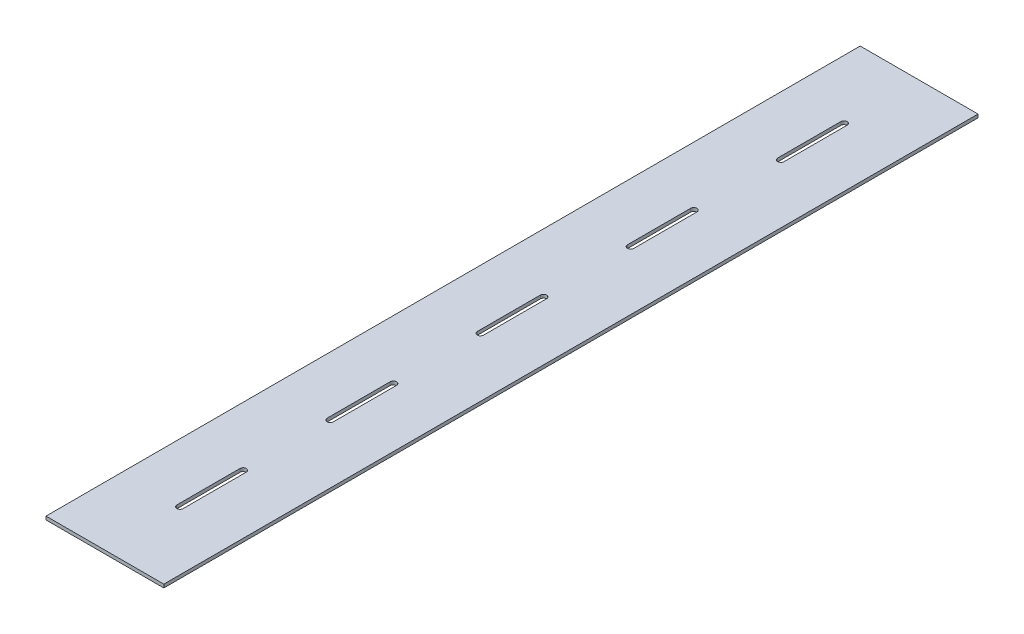
ISO-10303-21;
HEADER;
FILE_DESCRIPTION(('STEP AP214'),'2;1');
FILE_NAME('part.step','',(''),(''),'','','');
FILE_SCHEMA(('AUTOMOTIVE_DESIGN { 1 0 10303 214 1 1 1 1 }'));
ENDSEC;
DATA;
#1=APPLICATION_CONTEXT('core data for automotive mechanical design processes');
#2=APPLICATION_PROTOCOL_DEFINITION('international standard','automotive_design',2000,#1);
#3=PRODUCT_CONTEXT('',#1,'mechanical');
#4=PRODUCT('Part','Part','',(#3));
#5=PRODUCT_RELATED_PRODUCT_CATEGORY('part','',(#4));
#6=PRODUCT_DEFINITION_FORMATION('','',#4);
#7=PRODUCT_DEFINITION_CONTEXT('part definition',#1,'design');
#8=PRODUCT_DEFINITION('design','',#6,#7);
#9=PRODUCT_DEFINITION_SHAPE('','',#8);
#10=(LENGTH_UNIT() NAMED_UNIT(*) SI_UNIT(.MILLI.,.METRE.));
#11=(NAMED_UNIT(*) PLANE_ANGLE_UNIT() SI_UNIT($,.RADIAN.));
#12=(NAMED_UNIT(*) SI_UNIT($,.STERADIAN.) SOLID_ANGLE_UNIT());
#13=UNCERTAINTY_MEASURE_WITH_UNIT(LENGTH_MEASURE(1.E-05),#10,'distance_accuracy_value','');
#14=(GEOMETRIC_REPRESENTATION_CONTEXT(3) GLOBAL_UNCERTAINTY_ASSIGNED_CONTEXT((#13)) GLOBAL_UNIT_ASSIGNED_CONTEXT((#10,
#11,#12)) REPRESENTATION_CONTEXT('',''));
#15=CARTESIAN_POINT('',(0.,0.,0.));
#16=DIRECTION('',(0.,0.,1.));
#17=DIRECTION('',(1.,0.,0.));
#18=AXIS2_PLACEMENT_3D('',#15,#16,#17);
#19=CARTESIAN_POINT('',(7.4999999999999,-1.11022302462516E-13,-639.));
#20=DIRECTION('',(1.,0.,0.));
#21=DIRECTION('',(0.,0.,-1.));
#22=AXIS2_PLACEMENT_3D('',#19,#20,#21);
#23=PLANE('',#22);
#24=DIRECTION('',(0.,0.,-1.));
#25=VECTOR('',#24,1.);
#26=CARTESIAN_POINT('',(7.4999999999999,7.9999999999999,-639.));
#27=LINE('',#26,#25);
#28=CARTESIAN_POINT('',(7.4999999999999,8.00000000000001,-639.));
#29=VERTEX_POINT('',#28);
#30=CARTESIAN_POINT('',(7.4999999999999,7.9999999999999,-789.));
#31=VERTEX_POINT('',#30);
#32=EDGE_CURVE('E371',#29,#31,#27,.T.);
#33=ORIENTED_EDGE('',*,*,#32,.T.);
#34=DIRECTION('',(0.,1.,0.));
#35=VECTOR('',#34,1.);
#36=CARTESIAN_POINT('',(7.4999999999999,-1.11022302462516E-13,-789.));
#37=LINE('',#36,#35);
#38=CARTESIAN_POINT('',(7.4999999999999,0.,-789.));
#39=VERTEX_POINT('',#38);
#40=EDGE_CURVE('E11',#39,#31,#37,.T.);
#41=ORIENTED_EDGE('',*,*,#40,.F.);
#42=DIRECTION('',(0.,0.,-1.));
#43=VECTOR('',#42,1.);
#44=CARTESIAN_POINT('',(7.4999999999999,-1.11022302462516E-13,-639.));
#45=LINE('',#44,#43);
#46=CARTESIAN_POINT('',(7.4999999999999,-1.11022302462516E-13,-639.));
#47=VERTEX_POINT('',#46);
#48=EDGE_CURVE('E375',#47,#39,#45,.T.);
#49=ORIENTED_EDGE('',*,*,#48,.F.);
#50=DIRECTION('',(0.,1.,0.));
#51=VECTOR('',#50,1.);
#52=CARTESIAN_POINT('',(7.4999999999999,-1.11022302462516E-13,-639.));
#53=LINE('',#52,#51);
#54=EDGE_CURVE('E380',#47,#29,#53,.T.);
#55=ORIENTED_EDGE('',*,*,#54,.T.);
#56=EDGE_LOOP('',(#33,#41,#49,#55));
#57=FACE_BOUND('',#56,.T.);
#58=ADVANCED_FACE('F34',(#57),#23,.F.);
#59=CARTESIAN_POINT('',(-1.11022302462516E-13,0.,-789.));
#60=DIRECTION('',(0.,1.,0.));
#61=DIRECTION('',(0.,0.,1.));
#62=AXIS2_PLACEMENT_3D('',#59,#60,#61);
#63=CYLINDRICAL_SURFACE('',#62,7.49999999999999);
#64=CARTESIAN_POINT('',(-1.11022302462516E-13,8.00000000000001,-789.));
#65=DIRECTION('',(0.,1.,0.));
#66=DIRECTION('',(0.,0.,1.));
#67=AXIS2_PLACEMENT_3D('',#64,#65,#66);
#68=CIRCLE('',#67,7.49999999999999);
#69=CARTESIAN_POINT('',(-7.50000000000009,8.00000000000001,-789.));
#70=VERTEX_POINT('',#69);
#71=EDGE_CURVE('E368',#31,#70,#68,.T.);
#72=ORIENTED_EDGE('',*,*,#71,.T.);
#73=DIRECTION('',(0.,1.,0.));
#74=VECTOR('',#73,1.);
#75=CARTESIAN_POINT('',(-7.50000000000009,0.,-789.));
#76=LINE('',#75,#74);
#77=CARTESIAN_POINT('',(-7.50000000000009,0.,-789.));
#78=VERTEX_POINT('',#77);
#79=EDGE_CURVE('E41',#78,#70,#76,.T.);
#80=ORIENTED_EDGE('',*,*,#79,.F.);
#81=CARTESIAN_POINT('',(-1.11022302462516E-13,0.,-789.));
#82=DIRECTION('',(0.,1.,0.));
#83=DIRECTION('',(0.,0.,1.));
#84=AXIS2_PLACEMENT_3D('',#81,#82,#83);
#85=CIRCLE('',#84,7.49999999999999);
#86=EDGE_CURVE('E55',#39,#78,#85,.T.);
#87=ORIENTED_EDGE('',*,*,#86,.F.);
#88=ORIENTED_EDGE('',*,*,#40,.T.);
#89=EDGE_LOOP('',(#72,#80,#87,#88));
#90=FACE_BOUND('',#89,.T.);
#91=ADVANCED_FACE('F390',(#90),#63,.F.);
#92=CARTESIAN_POINT('',(-7.50000000000006,0.,-639.));
#93=DIRECTION('',(-1.,0.,0.));
#94=DIRECTION('',(0.,0.,1.));
#95=AXIS2_PLACEMENT_3D('',#92,#93,#94);
#96=PLANE('',#95);
#97=DIRECTION('',(0.,0.,1.));
#98=VECTOR('',#97,1.);
#99=CARTESIAN_POINT('',(-7.50000000000006,8.00000000000001,-639.));
#100=LINE('',#99,#98);
#101=CARTESIAN_POINT('',(-7.50000000000006,8.00000000000001,-639.));
#102=VERTEX_POINT('',#101);
#103=EDGE_CURVE('E365',#70,#102,#100,.T.);
#104=ORIENTED_EDGE('',*,*,#103,.T.);
#105=DIRECTION('',(0.,1.,0.));
#106=VECTOR('',#105,1.);
#107=CARTESIAN_POINT('',(-7.50000000000006,0.,-639.));
#108=LINE('',#107,#106);
#109=CARTESIAN_POINT('',(-7.50000000000006,0.,-639.));
#110=VERTEX_POINT('',#109);
#111=EDGE_CURVE('E383',#110,#102,#108,.T.);
#112=ORIENTED_EDGE('',*,*,#111,.F.);
#113=DIRECTION('',(0.,0.,1.));
#114=VECTOR('',#113,1.);
#115=CARTESIAN_POINT('',(-7.50000000000006,0.,-639.));
#116=LINE('',#115,#114);
#117=EDGE_CURVE('E378',#78,#110,#116,.T.);
#118=ORIENTED_EDGE('',*,*,#117,.F.);
#119=ORIENTED_EDGE('',*,*,#79,.T.);
#120=EDGE_LOOP('',(#104,#112,#118,#119));
#121=FACE_BOUND('',#120,.T.);
#122=ADVANCED_FACE('F387',(#121),#96,.F.);
#123=CARTESIAN_POINT('',(0.,0.,-639.));
#124=DIRECTION('',(0.,1.,0.));
#125=DIRECTION('',(0.,0.,1.));
#126=AXIS2_PLACEMENT_3D('',#123,#124,#125);
#127=CYLINDRICAL_SURFACE('',#126,7.49999999999998);
#128=CARTESIAN_POINT('',(0.,8.00000000000001,-639.));
#129=DIRECTION('',(0.,1.,0.));
#130=DIRECTION('',(0.,0.,1.));
#131=AXIS2_PLACEMENT_3D('',#128,#129,#130);
#132=CIRCLE('',#131,7.49999999999998);
#133=EDGE_CURVE('E363',#102,#29,#132,.T.);
#134=ORIENTED_EDGE('',*,*,#133,.T.);
#135=ORIENTED_EDGE('',*,*,#54,.F.);
#136=CARTESIAN_POINT('',(0.,0.,-639.));
#137=DIRECTION('',(0.,1.,0.));
#138=DIRECTION('',(0.,0.,1.));
#139=AXIS2_PLACEMENT_3D('',#136,#137,#138);
#140=CIRCLE('',#139,7.49999999999998);
#141=EDGE_CURVE('E48',#110,#47,#140,.T.);
#142=ORIENTED_EDGE('',*,*,#141,.F.);
#143=ORIENTED_EDGE('',*,*,#111,.T.);
#144=EDGE_LOOP('',(#134,#135,#142,#143));
#145=FACE_BOUND('',#144,.T.);
#146=ADVANCED_FACE('F396',(#145),#127,.F.);
#147=CARTESIAN_POINT('',(7.49999999999995,-1.11022302462516E-13,-282.));
#148=DIRECTION('',(1.,0.,0.));
#149=DIRECTION('',(0.,0.,-1.));
#150=AXIS2_PLACEMENT_3D('',#147,#148,#149);
#151=PLANE('',#150);
#152=DIRECTION('',(0.,0.,-1.));
#153=VECTOR('',#152,1.);
#154=CARTESIAN_POINT('',(7.49999999999995,7.9999999999999,-282.));
#155=LINE('',#154,#153);
#156=CARTESIAN_POINT('',(7.49999999999995,8.00000000000001,-282.));
#157=VERTEX_POINT('',#156);
#158=CARTESIAN_POINT('',(7.49999999999995,7.9999999999999,-432.));
#159=VERTEX_POINT('',#158);
#160=EDGE_CURVE('E339',#157,#159,#155,.T.);
#161=ORIENTED_EDGE('',*,*,#160,.T.);
#162=DIRECTION('',(0.,1.,0.));
#163=VECTOR('',#162,1.);
#164=CARTESIAN_POINT('',(7.49999999999995,-1.11022302462516E-13,-432.));
#165=LINE('',#164,#163);
#166=CARTESIAN_POINT('',(7.49999999999995,0.,-432.));
#167=VERTEX_POINT('',#166);
#168=EDGE_CURVE('E360',#167,#159,#165,.T.);
#169=ORIENTED_EDGE('',*,*,#168,.F.);
#170=DIRECTION('',(0.,0.,-1.));
#171=VECTOR('',#170,1.);
#172=CARTESIAN_POINT('',(7.49999999999995,-1.11022302462516E-13,-282.));
#173=LINE('',#172,#171);
#174=CARTESIAN_POINT('',(7.49999999999995,-1.11022302462516E-13,-282.));
#175=VERTEX_POINT('',#174);
#176=EDGE_CURVE('E344',#175,#167,#173,.T.);
#177=ORIENTED_EDGE('',*,*,#176,.F.);
#178=DIRECTION('',(0.,1.,0.));
#179=VECTOR('',#178,1.);
#180=CARTESIAN_POINT('',(7.49999999999995,-1.11022302462516E-13,-282.));
#181=LINE('',#180,#179);
#182=EDGE_CURVE('E351',#175,#157,#181,.T.);
#183=ORIENTED_EDGE('',*,*,#182,.T.);
#184=EDGE_LOOP('',(#161,#169,#177,#183));
#185=FACE_BOUND('',#184,.T.);
#186=ADVANCED_FACE('F398',(#185),#151,.F.);
#187=CARTESIAN_POINT('',(0.,0.,-432.));
#188=DIRECTION('',(0.,1.,0.));
#189=DIRECTION('',(0.,0.,1.));
#190=AXIS2_PLACEMENT_3D('',#187,#188,#189);
#191=CYLINDRICAL_SURFACE('',#190,7.49999999999999);
#192=CARTESIAN_POINT('',(0.,8.00000000000001,-432.));
#193=DIRECTION('',(0.,1.,0.));
#194=DIRECTION('',(0.,0.,1.));
#195=AXIS2_PLACEMENT_3D('',#192,#193,#194);
#196=CIRCLE('',#195,7.49999999999999);
#197=CARTESIAN_POINT('',(-7.50000000000003,8.00000000000001,-432.));
#198=VERTEX_POINT('',#197);
#199=EDGE_CURVE('E336',#159,#198,#196,.T.);
#200=ORIENTED_EDGE('',*,*,#199,.T.);
#201=DIRECTION('',(0.,1.,0.));
#202=VECTOR('',#201,1.);
#203=CARTESIAN_POINT('',(-7.50000000000003,0.,-432.));
#204=LINE('',#203,#202);
#205=CARTESIAN_POINT('',(-7.50000000000003,0.,-432.));
#206=VERTEX_POINT('',#205);
#207=EDGE_CURVE('E357',#206,#198,#204,.T.);
#208=ORIENTED_EDGE('',*,*,#207,.F.);
#209=CARTESIAN_POINT('',(0.,0.,-432.));
#210=DIRECTION('',(0.,1.,0.));
#211=DIRECTION('',(0.,0.,1.));
#212=AXIS2_PLACEMENT_3D('',#209,#210,#211);
#213=CIRCLE('',#212,7.49999999999999);
#214=EDGE_CURVE('E346',#167,#206,#213,.T.);
#215=ORIENTED_EDGE('',*,*,#214,.F.);
#216=ORIENTED_EDGE('',*,*,#168,.T.);
#217=EDGE_LOOP('',(#200,#208,#215,#216));
#218=FACE_BOUND('',#217,.T.);
#219=ADVANCED_FACE('F404',(#218),#191,.F.);
#220=CARTESIAN_POINT('',(-7.50000000000001,0.,-282.));
#221=DIRECTION('',(-1.,0.,0.));
#222=DIRECTION('',(0.,0.,1.));
#223=AXIS2_PLACEMENT_3D('',#220,#221,#222);
#224=PLANE('',#223);
#225=DIRECTION('',(0.,0.,1.));
#226=VECTOR('',#225,1.);
#227=CARTESIAN_POINT('',(-7.5,8.00000000000001,-282.));
#228=LINE('',#227,#226);
#229=CARTESIAN_POINT('',(-7.5,8.00000000000001,-282.));
#230=VERTEX_POINT('',#229);
#231=EDGE_CURVE('E333',#198,#230,#228,.T.);
#232=ORIENTED_EDGE('',*,*,#231,.T.);
#233=DIRECTION('',(0.,1.,0.));
#234=VECTOR('',#233,1.);
#235=CARTESIAN_POINT('',(-7.50000000000001,0.,-282.));
#236=LINE('',#235,#234);
#237=CARTESIAN_POINT('',(-7.50000000000001,0.,-282.));
#238=VERTEX_POINT('',#237);
#239=EDGE_CURVE('E354',#238,#230,#236,.T.);
#240=ORIENTED_EDGE('',*,*,#239,.F.);
#241=DIRECTION('',(0.,0.,1.));
#242=VECTOR('',#241,1.);
#243=CARTESIAN_POINT('',(-7.50000000000001,0.,-282.));
#244=LINE('',#243,#242);
#245=EDGE_CURVE('E348',#206,#238,#244,.T.);
#246=ORIENTED_EDGE('',*,*,#245,.F.);
#247=ORIENTED_EDGE('',*,*,#207,.T.);
#248=EDGE_LOOP('',(#232,#240,#246,#247));
#249=FACE_BOUND('',#248,.T.);
#250=ADVANCED_FACE('F437',(#249),#224,.F.);
#251=CARTESIAN_POINT('',(0.,0.,-282.));
#252=DIRECTION('',(0.,1.,0.));
#253=DIRECTION('',(0.,0.,1.));
#254=AXIS2_PLACEMENT_3D('',#251,#252,#253);
#255=CYLINDRICAL_SURFACE('',#254,7.49999999999998);
#256=CARTESIAN_POINT('',(0.,8.00000000000001,-282.));
#257=DIRECTION('',(0.,1.,0.));
#258=DIRECTION('',(0.,0.,1.));
#259=AXIS2_PLACEMENT_3D('',#256,#257,#258);
#260=CIRCLE('',#259,7.49999999999998);
#261=EDGE_CURVE('E331',#230,#157,#260,.T.);
#262=ORIENTED_EDGE('',*,*,#261,.T.);
#263=ORIENTED_EDGE('',*,*,#182,.F.);
#264=CARTESIAN_POINT('',(0.,0.,-282.));
#265=DIRECTION('',(0.,1.,0.));
#266=DIRECTION('',(0.,0.,1.));
#267=AXIS2_PLACEMENT_3D('',#264,#265,#266);
#268=CIRCLE('',#267,7.49999999999998);
#269=EDGE_CURVE('E342',#238,#175,#268,.T.);
#270=ORIENTED_EDGE('',*,*,#269,.F.);
#271=ORIENTED_EDGE('',*,*,#239,.T.);
#272=EDGE_LOOP('',(#262,#263,#270,#271));
#273=FACE_BOUND('',#272,.T.);
#274=ADVANCED_FACE('F447',(#273),#255,.F.);
#275=CARTESIAN_POINT('',(7.50000000000001,-1.11022302462516E-13,75.0000000000002));
#276=DIRECTION('',(1.,0.,0.));
#277=DIRECTION('',(0.,0.,-1.));
#278=AXIS2_PLACEMENT_3D('',#275,#276,#277);
#279=PLANE('',#278);
#280=DIRECTION('',(0.,0.,-1.));
#281=VECTOR('',#280,1.);
#282=CARTESIAN_POINT('',(7.50000000000001,7.9999999999999,75.0000000000002));
#283=LINE('',#282,#281);
#284=CARTESIAN_POINT('',(7.50000000000001,8.00000000000001,75.0000000000002));
#285=VERTEX_POINT('',#284);
#286=CARTESIAN_POINT('',(7.49999999999998,7.9999999999999,-74.9999999999997));
#287=VERTEX_POINT('',#286);
#288=EDGE_CURVE('E307',#285,#287,#283,.T.);
#289=ORIENTED_EDGE('',*,*,#288,.T.);
#290=DIRECTION('',(0.,1.,0.));
#291=VECTOR('',#290,1.);
#292=CARTESIAN_POINT('',(7.49999999999998,-1.11022302462516E-13,-74.9999999999997));
#293=LINE('',#292,#291);
#294=CARTESIAN_POINT('',(7.49999999999998,0.,-74.9999999999997));
#295=VERTEX_POINT('',#294);
#296=EDGE_CURVE('E328',#295,#287,#293,.T.);
#297=ORIENTED_EDGE('',*,*,#296,.F.);
#298=DIRECTION('',(0.,0.,-1.));
#299=VECTOR('',#298,1.);
#300=CARTESIAN_POINT('',(7.50000000000001,-1.11022302462516E-13,75.0000000000002));
#301=LINE('',#300,#299);
#302=CARTESIAN_POINT('',(7.50000000000001,-1.11022302462516E-13,75.0000000000002));
#303=VERTEX_POINT('',#302);
#304=EDGE_CURVE('E312',#303,#295,#301,.T.);
#305=ORIENTED_EDGE('',*,*,#304,.F.);
#306=DIRECTION('',(0.,1.,0.));
#307=VECTOR('',#306,1.);
#308=CARTESIAN_POINT('',(7.50000000000001,-1.11022302462516E-13,75.0000000000002));
#309=LINE('',#308,#307);
#310=EDGE_CURVE('E319',#303,#285,#309,.T.);
#311=ORIENTED_EDGE('',*,*,#310,.T.);
#312=EDGE_LOOP('',(#289,#297,#305,#311));
#313=FACE_BOUND('',#312,.T.);
#314=ADVANCED_FACE('F457',(#313),#279,.F.);
#315=CARTESIAN_POINT('',(0.,0.,-74.9999999999997));
#316=DIRECTION('',(0.,1.,0.));
#317=DIRECTION('',(0.,0.,1.));
#318=AXIS2_PLACEMENT_3D('',#315,#316,#317);
#319=CYLINDRICAL_SURFACE('',#318,7.49999999999999);
#320=CARTESIAN_POINT('',(0.,8.00000000000001,-74.9999999999997));
#321=DIRECTION('',(0.,1.,0.));
#322=DIRECTION('',(0.,0.,1.));
#323=AXIS2_PLACEMENT_3D('',#320,#321,#322);
#324=CIRCLE('',#323,7.49999999999999);
#325=CARTESIAN_POINT('',(-7.49999999999998,8.00000000000001,-74.9999999999997));
#326=VERTEX_POINT('',#325);
#327=EDGE_CURVE('E304',#287,#326,#324,.T.);
#328=ORIENTED_EDGE('',*,*,#327,.T.);
#329=DIRECTION('',(0.,1.,0.));
#330=VECTOR('',#329,1.);
#331=CARTESIAN_POINT('',(-7.49999999999998,0.,-74.9999999999997));
#332=LINE('',#331,#330);
#333=CARTESIAN_POINT('',(-7.49999999999998,0.,-74.9999999999997));
#334=VERTEX_POINT('',#333);
#335=EDGE_CURVE('E325',#334,#326,#332,.T.);
#336=ORIENTED_EDGE('',*,*,#335,.F.);
#337=CARTESIAN_POINT('',(0.,0.,-74.9999999999997));
#338=DIRECTION('',(0.,1.,0.));
#339=DIRECTION('',(0.,0.,1.));
#340=AXIS2_PLACEMENT_3D('',#337,#338,#339);
#341=CIRCLE('',#340,7.49999999999999);
#342=EDGE_CURVE('E314',#295,#334,#341,.T.);
#343=ORIENTED_EDGE('',*,*,#342,.F.);
#344=ORIENTED_EDGE('',*,*,#296,.T.);
#345=EDGE_LOOP('',(#328,#336,#343,#344));
#346=FACE_BOUND('',#345,.T.);
#347=ADVANCED_FACE('F467',(#346),#319,.F.);
#348=CARTESIAN_POINT('',(-7.49999999999995,0.,75.0000000000002));
#349=DIRECTION('',(-1.,0.,0.));
#350=DIRECTION('',(0.,0.,1.));
#351=AXIS2_PLACEMENT_3D('',#348,#349,#350);
#352=PLANE('',#351);
#353=DIRECTION('',(0.,0.,1.));
#354=VECTOR('',#353,1.);
#355=CARTESIAN_POINT('',(-7.49999999999995,8.00000000000001,75.0000000000002));
#356=LINE('',#355,#354);
#357=CARTESIAN_POINT('',(-7.49999999999995,8.00000000000001,75.0000000000002));
#358=VERTEX_POINT('',#357);
#359=EDGE_CURVE('E301',#326,#358,#356,.T.);
#360=ORIENTED_EDGE('',*,*,#359,.T.);
#361=DIRECTION('',(0.,1.,0.));
#362=VECTOR('',#361,1.);
#363=CARTESIAN_POINT('',(-7.49999999999995,0.,75.0000000000002));
#364=LINE('',#363,#362);
#365=CARTESIAN_POINT('',(-7.49999999999995,0.,75.0000000000002));
#366=VERTEX_POINT('',#365);
#367=EDGE_CURVE('E322',#366,#358,#364,.T.);
#368=ORIENTED_EDGE('',*,*,#367,.F.);
#369=DIRECTION('',(0.,0.,1.));
#370=VECTOR('',#369,1.);
#371=CARTESIAN_POINT('',(-7.49999999999995,0.,75.0000000000002));
#372=LINE('',#371,#370);
#373=EDGE_CURVE('E316',#334,#366,#372,.T.);
#374=ORIENTED_EDGE('',*,*,#373,.F.);
#375=ORIENTED_EDGE('',*,*,#335,.T.);
#376=EDGE_LOOP('',(#360,#368,#374,#375));
#377=FACE_BOUND('',#376,.T.);
#378=ADVANCED_FACE('F477',(#377),#352,.F.);
#379=CARTESIAN_POINT('',(0.,-1.11022302462516E-13,75.0000000000002));
#380=DIRECTION('',(0.,1.,0.));
#381=DIRECTION('',(0.,0.,1.));
#382=AXIS2_PLACEMENT_3D('',#379,#380,#381);
#383=CYLINDRICAL_SURFACE('',#382,7.49999999999998);
#384=CARTESIAN_POINT('',(0.,8.00000000000001,75.0000000000002));
#385=DIRECTION('',(0.,1.,0.));
#386=DIRECTION('',(0.,0.,1.));
#387=AXIS2_PLACEMENT_3D('',#384,#385,#386);
#388=CIRCLE('',#387,7.49999999999998);
#389=EDGE_CURVE('E299',#358,#285,#388,.T.);
#390=ORIENTED_EDGE('',*,*,#389,.T.);
#391=ORIENTED_EDGE('',*,*,#310,.F.);
#392=CARTESIAN_POINT('',(0.,-1.11022302462516E-13,75.0000000000002));
#393=DIRECTION('',(0.,1.,0.));
#394=DIRECTION('',(0.,0.,1.));
#395=AXIS2_PLACEMENT_3D('',#392,#393,#394);
#396=CIRCLE('',#395,7.49999999999998);
#397=EDGE_CURVE('E310',#366,#303,#396,.T.);
#398=ORIENTED_EDGE('',*,*,#397,.F.);
#399=ORIENTED_EDGE('',*,*,#367,.T.);
#400=EDGE_LOOP('',(#390,#391,#398,#399));
#401=FACE_BOUND('',#400,.T.);
#402=ADVANCED_FACE('F487',(#401),#383,.F.);
#403=CARTESIAN_POINT('',(140.,8.00000000000001,-967.5));
#404=DIRECTION('',(-1.,0.,0.));
#405=DIRECTION('',(0.,0.,1.));
#406=AXIS2_PLACEMENT_3D('',#403,#404,#405);
#407=PLANE('',#406);
#408=DIRECTION('',(0.,0.,-1.));
#409=VECTOR('',#408,1.);
#410=CARTESIAN_POINT('',(140.,0.,-967.5));
#411=LINE('',#410,#409);
#412=CARTESIAN_POINT('',(140.,0.,967.5));
#413=VERTEX_POINT('',#412);
#414=CARTESIAN_POINT('',(140.,0.,-967.5));
#415=VERTEX_POINT('',#414);
#416=EDGE_CURVE('E263',#413,#415,#411,.T.);
#417=ORIENTED_EDGE('',*,*,#416,.T.);
#418=DIRECTION('',(0.,-1.,0.));
#419=VECTOR('',#418,1.);
#420=CARTESIAN_POINT('',(140.,8.00000000000001,-967.5));
#421=LINE('',#420,#419);
#422=CARTESIAN_POINT('',(140.,8.00000000000001,-967.5));
#423=VERTEX_POINT('',#422);
#424=EDGE_CURVE('E296',#423,#415,#421,.T.);
#425=ORIENTED_EDGE('',*,*,#424,.F.);
#426=DIRECTION('',(0.,0.,-1.));
#427=VECTOR('',#426,1.);
#428=CARTESIAN_POINT('',(140.,8.00000000000001,-967.5));
#429=LINE('',#428,#427);
#430=CARTESIAN_POINT('',(140.,8.00000000000001,967.5));
#431=VERTEX_POINT('',#430);
#432=EDGE_CURVE('E270',#431,#423,#429,.T.);
#433=ORIENTED_EDGE('',*,*,#432,.F.);
#434=DIRECTION('',(0.,-1.,0.));
#435=VECTOR('',#434,1.);
#436=CARTESIAN_POINT('',(140.,8.00000000000001,967.5));
#437=LINE('',#436,#435);
#438=EDGE_CURVE('E280',#431,#413,#437,.T.);
#439=ORIENTED_EDGE('',*,*,#438,.T.);
#440=EDGE_LOOP('',(#417,#425,#433,#439));
#441=FACE_BOUND('',#440,.T.);
#442=ADVANCED_FACE('F497',(#441),#407,.F.);
#443=CARTESIAN_POINT('',(-140.,7.99999999999801,-967.5));
#444=DIRECTION('',(0.,0.,1.));
#445=DIRECTION('',(1.,0.,0.));
#446=AXIS2_PLACEMENT_3D('',#443,#444,#445);
#447=PLANE('',#446);
#448=DIRECTION('',(-1.,0.,0.));
#449=VECTOR('',#448,1.);
#450=CARTESIAN_POINT('',(-140.,-1.99840144432528E-12,-967.5));
#451=LINE('',#450,#449);
#452=CARTESIAN_POINT('',(-140.,-1.99840144432528E-12,-967.5));
#453=VERTEX_POINT('',#452);
#454=EDGE_CURVE('E283',#415,#453,#451,.T.);
#455=ORIENTED_EDGE('',*,*,#454,.T.);
#456=DIRECTION('',(0.,-1.,0.));
#457=VECTOR('',#456,1.);
#458=CARTESIAN_POINT('',(-140.,7.99999999999801,-967.5));
#459=LINE('',#458,#457);
#460=CARTESIAN_POINT('',(-140.,7.99999999999801,-967.5));
#461=VERTEX_POINT('',#460);
#462=EDGE_CURVE('E293',#461,#453,#459,.T.);
#463=ORIENTED_EDGE('',*,*,#462,.F.);
#464=DIRECTION('',(-1.,0.,0.));
#465=VECTOR('',#464,1.);
#466=CARTESIAN_POINT('',(-140.,7.99999999999801,-967.5));
#467=LINE('',#466,#465);
#468=EDGE_CURVE('E273',#423,#461,#467,.T.);
#469=ORIENTED_EDGE('',*,*,#468,.F.);
#470=ORIENTED_EDGE('',*,*,#424,.T.);
#471=EDGE_LOOP('',(#455,#463,#469,#470));
#472=FACE_BOUND('',#471,.T.);
#473=ADVANCED_FACE('F508',(#472),#447,.F.);
#474=CARTESIAN_POINT('',(-140.,7.99999999999801,-967.5));
#475=DIRECTION('',(1.,0.,0.));
#476=DIRECTION('',(0.,0.,-1.));
#477=AXIS2_PLACEMENT_3D('',#474,#475,#476);
#478=PLANE('',#477);
#479=DIRECTION('',(0.,0.,1.));
#480=VECTOR('',#479,1.);
#481=CARTESIAN_POINT('',(-140.,-1.99840144432528E-12,-967.5));
#482=LINE('',#481,#480);
#483=CARTESIAN_POINT('',(-140.,-1.99840144432528E-12,967.5));
#484=VERTEX_POINT('',#483);
#485=EDGE_CURVE('E285',#453,#484,#482,.T.);
#486=ORIENTED_EDGE('',*,*,#485,.T.);
#487=DIRECTION('',(0.,-1.,0.));
#488=VECTOR('',#487,1.);
#489=CARTESIAN_POINT('',(-140.,7.99999999999801,967.5));
#490=LINE('',#489,#488);
#491=CARTESIAN_POINT('',(-140.,7.99999999999801,967.5));
#492=VERTEX_POINT('',#491);
#493=EDGE_CURVE('E290',#492,#484,#490,.T.);
#494=ORIENTED_EDGE('',*,*,#493,.F.);
#495=DIRECTION('',(0.,0.,1.));
#496=VECTOR('',#495,1.);
#497=CARTESIAN_POINT('',(-140.,7.99999999999801,-967.5));
#498=LINE('',#497,#496);
#499=EDGE_CURVE('E276',#461,#492,#498,.T.);
#500=ORIENTED_EDGE('',*,*,#499,.F.);
#501=ORIENTED_EDGE('',*,*,#462,.T.);
#502=EDGE_LOOP('',(#486,#494,#500,#501));
#503=FACE_BOUND('',#502,.T.);
#504=ADVANCED_FACE('F518',(#503),#478,.F.);
#505=CARTESIAN_POINT('',(-140.,7.99999999999801,967.5));
#506=DIRECTION('',(0.,0.,-1.));
#507=DIRECTION('',(-1.,0.,0.));
#508=AXIS2_PLACEMENT_3D('',#505,#506,#507);
#509=PLANE('',#508);
#510=DIRECTION('',(1.,0.,0.));
#511=VECTOR('',#510,1.);
#512=CARTESIAN_POINT('',(-140.,-1.99840144432528E-12,967.5));
#513=LINE('',#512,#511);
#514=EDGE_CURVE('E274',#484,#413,#513,.T.);
#515=ORIENTED_EDGE('',*,*,#514,.T.);
#516=ORIENTED_EDGE('',*,*,#438,.F.);
#517=DIRECTION('',(1.,0.,0.));
#518=VECTOR('',#517,1.);
#519=CARTESIAN_POINT('',(-140.,7.99999999999801,967.5));
#520=LINE('',#519,#518);
#521=EDGE_CURVE('E278',#492,#431,#520,.T.);
#522=ORIENTED_EDGE('',*,*,#521,.F.);
#523=ORIENTED_EDGE('',*,*,#493,.T.);
#524=EDGE_LOOP('',(#515,#516,#522,#523));
#525=FACE_BOUND('',#524,.T.);
#526=ADVANCED_FACE('F528',(#525),#509,.F.);
#527=CARTESIAN_POINT('',(0.,8.00000000000001,0.));
#528=DIRECTION('',(0.,1.,0.));
#529=DIRECTION('',(0.,0.,1.));
#530=AXIS2_PLACEMENT_3D('',#527,#528,#529);
#531=PLANE('',#530);
#532=CARTESIAN_POINT('',(0.,8.00000000000001,432.));
#533=DIRECTION('',(0.,1.,0.));
#534=DIRECTION('',(0.,0.,1.));
#535=AXIS2_PLACEMENT_3D('',#532,#533,#534);
#536=CIRCLE('',#535,7.49999999999998);
#537=CARTESIAN_POINT('',(-7.49999999999992,8.00000000000001,432.));
#538=VERTEX_POINT('',#537);
#539=CARTESIAN_POINT('',(7.50000000000007,8.00000000000001,432.));
#540=VERTEX_POINT('',#539);
#541=EDGE_CURVE('E232',#538,#540,#536,.T.);
#542=ORIENTED_EDGE('',*,*,#541,.F.);
#543=DIRECTION('',(0.,0.,1.));
#544=VECTOR('',#543,1.);
#545=CARTESIAN_POINT('',(-7.49999999999992,8.00000000000001,432.));
#546=LINE('',#545,#544);
#547=CARTESIAN_POINT('',(-7.49999999999992,8.00000000000001,282.));
#548=VERTEX_POINT('',#547);
#549=EDGE_CURVE('E218',#548,#538,#546,.T.);
#550=ORIENTED_EDGE('',*,*,#549,.F.);
#551=CARTESIAN_POINT('',(0.,8.00000000000001,282.));
#552=DIRECTION('',(0.,1.,0.));
#553=DIRECTION('',(0.,0.,1.));
#554=AXIS2_PLACEMENT_3D('',#551,#552,#553);
#555=CIRCLE('',#554,7.49999999999999);
#556=CARTESIAN_POINT('',(7.50000000000004,7.9999999999999,282.));
#557=VERTEX_POINT('',#556);
#558=EDGE_CURVE('E210',#557,#548,#555,.T.);
#559=ORIENTED_EDGE('',*,*,#558,.F.);
#560=DIRECTION('',(0.,0.,-1.));
#561=VECTOR('',#560,1.);
#562=CARTESIAN_POINT('',(7.50000000000007,7.9999999999999,432.));
#563=LINE('',#562,#561);
#564=EDGE_CURVE('E196',#540,#557,#563,.T.);
#565=ORIENTED_EDGE('',*,*,#564,.F.);
#566=EDGE_LOOP('',(#542,#550,#559,#565));
#567=FACE_BOUND('',#566,.T.);
#568=CARTESIAN_POINT('',(1.38777878078145E-13,8.00000000000001,789.));
#569=DIRECTION('',(0.,1.,0.));
#570=DIRECTION('',(0.,0.,1.));
#571=AXIS2_PLACEMENT_3D('',#568,#569,#570);
#572=CIRCLE('',#571,7.49999999999998);
#573=CARTESIAN_POINT('',(-7.49999999999986,8.00000000000001,789.));
#574=VERTEX_POINT('',#573);
#575=CARTESIAN_POINT('',(7.50000000000012,8.00000000000001,789.));
#576=VERTEX_POINT('',#575);
#577=EDGE_CURVE('E237',#574,#576,#572,.T.);
#578=ORIENTED_EDGE('',*,*,#577,.F.);
#579=DIRECTION('',(0.,0.,1.));
#580=VECTOR('',#579,1.);
#581=CARTESIAN_POINT('',(-7.49999999999986,8.00000000000001,789.));
#582=LINE('',#581,#580);
#583=CARTESIAN_POINT('',(-7.49999999999986,8.00000000000001,639.));
#584=VERTEX_POINT('',#583);
#585=EDGE_CURVE('E242',#584,#574,#582,.T.);
#586=ORIENTED_EDGE('',*,*,#585,.F.);
#587=CARTESIAN_POINT('',(1.11022302462516E-13,8.00000000000001,639.));
#588=DIRECTION('',(0.,1.,0.));
#589=DIRECTION('',(0.,0.,1.));
#590=AXIS2_PLACEMENT_3D('',#587,#588,#589);
#591=CIRCLE('',#590,7.49999999999999);
#592=CARTESIAN_POINT('',(7.50000000000009,7.9999999999999,639.));
#593=VERTEX_POINT('',#592);
#594=EDGE_CURVE('E256',#593,#584,#591,.T.);
#595=ORIENTED_EDGE('',*,*,#594,.F.);
#596=DIRECTION('',(0.,0.,-1.));
#597=VECTOR('',#596,1.);
#598=CARTESIAN_POINT('',(7.50000000000012,7.9999999999999,789.));
#599=LINE('',#598,#597);
#600=EDGE_CURVE('E253',#576,#593,#599,.T.);
#601=ORIENTED_EDGE('',*,*,#600,.F.);
#602=EDGE_LOOP('',(#578,#586,#595,#601));
#603=FACE_BOUND('',#602,.T.);
#604=ORIENTED_EDGE('',*,*,#432,.T.);
#605=ORIENTED_EDGE('',*,*,#468,.T.);
#606=ORIENTED_EDGE('',*,*,#499,.T.);
#607=ORIENTED_EDGE('',*,*,#521,.T.);
#608=EDGE_LOOP('',(#604,#605,#606,#607));
#609=FACE_BOUND('',#608,.T.);
#610=ORIENTED_EDGE('',*,*,#389,.F.);
#611=ORIENTED_EDGE('',*,*,#359,.F.);
#612=ORIENTED_EDGE('',*,*,#327,.F.);
#613=ORIENTED_EDGE('',*,*,#288,.F.);
#614=EDGE_LOOP('',(#610,#611,#612,#613));
#615=FACE_BOUND('',#614,.T.);
#616=ORIENTED_EDGE('',*,*,#261,.F.);
#617=ORIENTED_EDGE('',*,*,#231,.F.);
#618=ORIENTED_EDGE('',*,*,#199,.F.);
#619=ORIENTED_EDGE('',*,*,#160,.F.);
#620=EDGE_LOOP('',(#616,#617,#618,#619));
#621=FACE_BOUND('',#620,.T.);
#622=ORIENTED_EDGE('',*,*,#133,.F.);
#623=ORIENTED_EDGE('',*,*,#103,.F.);
#624=ORIENTED_EDGE('',*,*,#71,.F.);
#625=ORIENTED_EDGE('',*,*,#32,.F.);
#626=EDGE_LOOP('',(#622,#623,#624,#625));
#627=FACE_BOUND('',#626,.T.);
#628=ADVANCED_FACE('F216',(#567,#603,#609,#615,#621,#627),#531,.T.);
#629=CARTESIAN_POINT('',(0.,0.,0.));
#630=DIRECTION('',(0.,1.,0.));
#631=DIRECTION('',(0.,0.,1.));
#632=AXIS2_PLACEMENT_3D('',#629,#630,#631);
#633=PLANE('',#632);
#634=DIRECTION('',(0.,0.,1.));
#635=VECTOR('',#634,1.);
#636=CARTESIAN_POINT('',(-7.49999999999992,0.,432.));
#637=LINE('',#636,#635);
#638=CARTESIAN_POINT('',(-7.49999999999992,0.,282.));
#639=VERTEX_POINT('',#638);
#640=CARTESIAN_POINT('',(-7.49999999999992,0.,432.));
#641=VERTEX_POINT('',#640);
#642=EDGE_CURVE('E229',#639,#641,#637,.T.);
#643=ORIENTED_EDGE('',*,*,#642,.T.);
#644=CARTESIAN_POINT('',(0.,-1.11022302462516E-13,432.));
#645=DIRECTION('',(0.,1.,0.));
#646=DIRECTION('',(0.,0.,1.));
#647=AXIS2_PLACEMENT_3D('',#644,#645,#646);
#648=CIRCLE('',#647,7.49999999999998);
#649=CARTESIAN_POINT('',(7.50000000000006,-1.11022302462516E-13,432.));
#650=VERTEX_POINT('',#649);
#651=EDGE_CURVE('E234',#641,#650,#648,.T.);
#652=ORIENTED_EDGE('',*,*,#651,.T.);
#653=DIRECTION('',(0.,0.,-1.));
#654=VECTOR('',#653,1.);
#655=CARTESIAN_POINT('',(7.50000000000006,-1.11022302462516E-13,432.));
#656=LINE('',#655,#654);
#657=CARTESIAN_POINT('',(7.50000000000003,0.,282.));
#658=VERTEX_POINT('',#657);
#659=EDGE_CURVE('E206',#650,#658,#656,.T.);
#660=ORIENTED_EDGE('',*,*,#659,.T.);
#661=CARTESIAN_POINT('',(0.,-1.11022302462516E-13,282.));
#662=DIRECTION('',(0.,1.,0.));
#663=DIRECTION('',(0.,0.,1.));
#664=AXIS2_PLACEMENT_3D('',#661,#662,#663);
#665=CIRCLE('',#664,7.49999999999999);
#666=EDGE_CURVE('E213',#658,#639,#665,.T.);
#667=ORIENTED_EDGE('',*,*,#666,.T.);
#668=EDGE_LOOP('',(#643,#652,#660,#667));
#669=FACE_BOUND('',#668,.T.);
#670=DIRECTION('',(0.,0.,1.));
#671=VECTOR('',#670,1.);
#672=CARTESIAN_POINT('',(-7.49999999999987,0.,789.));
#673=LINE('',#672,#671);
#674=CARTESIAN_POINT('',(-7.49999999999987,0.,639.));
#675=VERTEX_POINT('',#674);
#676=CARTESIAN_POINT('',(-7.49999999999987,0.,789.));
#677=VERTEX_POINT('',#676);
#678=EDGE_CURVE('E248',#675,#677,#673,.T.);
#679=ORIENTED_EDGE('',*,*,#678,.T.);
#680=CARTESIAN_POINT('',(1.38777878078145E-13,-1.11022302462516E-13,789.));
#681=DIRECTION('',(0.,1.,0.));
#682=DIRECTION('',(0.,0.,1.));
#683=AXIS2_PLACEMENT_3D('',#680,#681,#682);
#684=CIRCLE('',#683,7.49999999999998);
#685=CARTESIAN_POINT('',(7.50000000000012,-1.11022302462516E-13,789.));
#686=VERTEX_POINT('',#685);
#687=EDGE_CURVE('E238',#677,#686,#684,.T.);
#688=ORIENTED_EDGE('',*,*,#687,.T.);
#689=DIRECTION('',(0.,0.,-1.));
#690=VECTOR('',#689,1.);
#691=CARTESIAN_POINT('',(7.50000000000012,-1.11022302462516E-13,789.));
#692=LINE('',#691,#690);
#693=CARTESIAN_POINT('',(7.50000000000009,0.,639.));
#694=VERTEX_POINT('',#693);
#695=EDGE_CURVE('E241',#686,#694,#692,.T.);
#696=ORIENTED_EDGE('',*,*,#695,.T.);
#697=CARTESIAN_POINT('',(1.11022302462516E-13,-1.11022302462516E-13,639.));
#698=DIRECTION('',(0.,1.,0.));
#699=DIRECTION('',(0.,0.,1.));
#700=AXIS2_PLACEMENT_3D('',#697,#698,#699);
#701=CIRCLE('',#700,7.49999999999999);
#702=EDGE_CURVE('E245',#694,#675,#701,.T.);
#703=ORIENTED_EDGE('',*,*,#702,.T.);
#704=EDGE_LOOP('',(#679,#688,#696,#703));
#705=FACE_BOUND('',#704,.T.);
#706=ORIENTED_EDGE('',*,*,#416,.F.);
#707=ORIENTED_EDGE('',*,*,#514,.F.);
#708=ORIENTED_EDGE('',*,*,#485,.F.);
#709=ORIENTED_EDGE('',*,*,#454,.F.);
#710=EDGE_LOOP('',(#706,#707,#708,#709));
#711=FACE_BOUND('',#710,.T.);
#712=ORIENTED_EDGE('',*,*,#397,.T.);
#713=ORIENTED_EDGE('',*,*,#304,.T.);
#714=ORIENTED_EDGE('',*,*,#342,.T.);
#715=ORIENTED_EDGE('',*,*,#373,.T.);
#716=EDGE_LOOP('',(#712,#713,#714,#715));
#717=FACE_BOUND('',#716,.T.);
#718=ORIENTED_EDGE('',*,*,#269,.T.);
#719=ORIENTED_EDGE('',*,*,#176,.T.);
#720=ORIENTED_EDGE('',*,*,#214,.T.);
#721=ORIENTED_EDGE('',*,*,#245,.T.);
#722=EDGE_LOOP('',(#718,#719,#720,#721));
#723=FACE_BOUND('',#722,.T.);
#724=ORIENTED_EDGE('',*,*,#141,.T.);
#725=ORIENTED_EDGE('',*,*,#48,.T.);
#726=ORIENTED_EDGE('',*,*,#86,.T.);
#727=ORIENTED_EDGE('',*,*,#117,.T.);
#728=EDGE_LOOP('',(#724,#725,#726,#727));
#729=FACE_BOUND('',#728,.T.);
#730=ADVANCED_FACE('F547',(#669,#705,#711,#717,#723,#729),#633,.F.);
#731=CARTESIAN_POINT('',(1.38777878078145E-13,-1.11022302462516E-13,789.));
#732=DIRECTION('',(0.,1.,0.));
#733=DIRECTION('',(0.,0.,1.));
#734=AXIS2_PLACEMENT_3D('',#731,#732,#733);
#735=CYLINDRICAL_SURFACE('',#734,7.49999999999998);
#736=ORIENTED_EDGE('',*,*,#577,.T.);
#737=DIRECTION('',(0.,1.,0.));
#738=VECTOR('',#737,1.);
#739=CARTESIAN_POINT('',(7.50000000000012,-1.11022302462516E-13,789.));
#740=LINE('',#739,#738);
#741=EDGE_CURVE('E251',#686,#576,#740,.T.);
#742=ORIENTED_EDGE('',*,*,#741,.F.);
#743=ORIENTED_EDGE('',*,*,#687,.F.);
#744=DIRECTION('',(0.,1.,0.));
#745=VECTOR('',#744,1.);
#746=CARTESIAN_POINT('',(-7.49999999999987,0.,789.));
#747=LINE('',#746,#745);
#748=EDGE_CURVE('E261',#677,#574,#747,.T.);
#749=ORIENTED_EDGE('',*,*,#748,.T.);
#750=EDGE_LOOP('',(#736,#742,#743,#749));
#751=FACE_BOUND('',#750,.T.);
#752=ADVANCED_FACE('F556',(#751),#735,.F.);
#753=CARTESIAN_POINT('',(-7.49999999999987,0.,789.));
#754=DIRECTION('',(-1.,0.,0.));
#755=DIRECTION('',(0.,0.,1.));
#756=AXIS2_PLACEMENT_3D('',#753,#754,#755);
#757=PLANE('',#756);
#758=ORIENTED_EDGE('',*,*,#585,.T.);
#759=ORIENTED_EDGE('',*,*,#748,.F.);
#760=ORIENTED_EDGE('',*,*,#678,.F.);
#761=DIRECTION('',(0.,1.,0.));
#762=VECTOR('',#761,1.);
#763=CARTESIAN_POINT('',(-7.49999999999987,0.,639.));
#764=LINE('',#763,#762);
#765=EDGE_CURVE('E264',#675,#584,#764,.T.);
#766=ORIENTED_EDGE('',*,*,#765,.T.);
#767=EDGE_LOOP('',(#758,#759,#760,#766));
#768=FACE_BOUND('',#767,.T.);
#769=ADVANCED_FACE('F566',(#768),#757,.F.);
#770=CARTESIAN_POINT('',(1.11022302462516E-13,-1.11022302462516E-13,639.));
#771=DIRECTION('',(0.,1.,0.));
#772=DIRECTION('',(0.,0.,1.));
#773=AXIS2_PLACEMENT_3D('',#770,#771,#772);
#774=CYLINDRICAL_SURFACE('',#773,7.49999999999999);
#775=ORIENTED_EDGE('',*,*,#594,.T.);
#776=ORIENTED_EDGE('',*,*,#765,.F.);
#777=ORIENTED_EDGE('',*,*,#702,.F.);
#778=DIRECTION('',(0.,1.,0.));
#779=VECTOR('',#778,1.);
#780=CARTESIAN_POINT('',(7.50000000000009,-1.11022302462516E-13,639.));
#781=LINE('',#780,#779);
#782=EDGE_CURVE('E266',#694,#593,#781,.T.);
#783=ORIENTED_EDGE('',*,*,#782,.T.);
#784=EDGE_LOOP('',(#775,#776,#777,#783));
#785=FACE_BOUND('',#784,.T.);
#786=ADVANCED_FACE('F576',(#785),#774,.F.);
#787=CARTESIAN_POINT('',(7.50000000000012,-1.11022302462516E-13,789.));
#788=DIRECTION('',(1.,0.,0.));
#789=DIRECTION('',(0.,0.,-1.));
#790=AXIS2_PLACEMENT_3D('',#787,#788,#789);
#791=PLANE('',#790);
#792=ORIENTED_EDGE('',*,*,#600,.T.);
#793=ORIENTED_EDGE('',*,*,#782,.F.);
#794=ORIENTED_EDGE('',*,*,#695,.F.);
#795=ORIENTED_EDGE('',*,*,#741,.T.);
#796=EDGE_LOOP('',(#792,#793,#794,#795));
#797=FACE_BOUND('',#796,.T.);
#798=ADVANCED_FACE('F586',(#797),#791,.F.);
#799=CARTESIAN_POINT('',(0.,-1.11022302462516E-13,432.));
#800=DIRECTION('',(0.,1.,0.));
#801=DIRECTION('',(0.,0.,1.));
#802=AXIS2_PLACEMENT_3D('',#799,#800,#801);
#803=CYLINDRICAL_SURFACE('',#802,7.49999999999998);
#804=ORIENTED_EDGE('',*,*,#541,.T.);
#805=DIRECTION('',(0.,1.,0.));
#806=VECTOR('',#805,1.);
#807=CARTESIAN_POINT('',(7.50000000000006,-1.11022302462516E-13,432.));
#808=LINE('',#807,#806);
#809=EDGE_CURVE('E202',#650,#540,#808,.T.);
#810=ORIENTED_EDGE('',*,*,#809,.F.);
#811=ORIENTED_EDGE('',*,*,#651,.F.);
#812=DIRECTION('',(0.,1.,0.));
#813=VECTOR('',#812,1.);
#814=CARTESIAN_POINT('',(-7.49999999999992,0.,432.));
#815=LINE('',#814,#813);
#816=EDGE_CURVE('E226',#641,#538,#815,.T.);
#817=ORIENTED_EDGE('',*,*,#816,.T.);
#818=EDGE_LOOP('',(#804,#810,#811,#817));
#819=FACE_BOUND('',#818,.T.);
#820=ADVANCED_FACE('F596',(#819),#803,.F.);
#821=CARTESIAN_POINT('',(-7.49999999999992,0.,432.));
#822=DIRECTION('',(-1.,0.,0.));
#823=DIRECTION('',(0.,0.,1.));
#824=AXIS2_PLACEMENT_3D('',#821,#822,#823);
#825=PLANE('',#824);
#826=ORIENTED_EDGE('',*,*,#549,.T.);
#827=ORIENTED_EDGE('',*,*,#816,.F.);
#828=ORIENTED_EDGE('',*,*,#642,.F.);
#829=DIRECTION('',(0.,1.,0.));
#830=VECTOR('',#829,1.);
#831=CARTESIAN_POINT('',(-7.49999999999992,0.,282.));
#832=LINE('',#831,#830);
#833=EDGE_CURVE('E219',#639,#548,#832,.T.);
#834=ORIENTED_EDGE('',*,*,#833,.T.);
#835=EDGE_LOOP('',(#826,#827,#828,#834));
#836=FACE_BOUND('',#835,.T.);
#837=ADVANCED_FACE('F606',(#836),#825,.F.);
#838=CARTESIAN_POINT('',(0.,-1.11022302462516E-13,282.));
#839=DIRECTION('',(0.,1.,0.));
#840=DIRECTION('',(0.,0.,1.));
#841=AXIS2_PLACEMENT_3D('',#838,#839,#840);
#842=CYLINDRICAL_SURFACE('',#841,7.49999999999999);
#843=ORIENTED_EDGE('',*,*,#558,.T.);
#844=ORIENTED_EDGE('',*,*,#833,.F.);
#845=ORIENTED_EDGE('',*,*,#666,.F.);
#846=DIRECTION('',(0.,1.,0.));
#847=VECTOR('',#846,1.);
#848=CARTESIAN_POINT('',(7.50000000000003,-1.11022302462516E-13,282.));
#849=LINE('',#848,#847);
#850=EDGE_CURVE('E199',#658,#557,#849,.T.);
#851=ORIENTED_EDGE('',*,*,#850,.T.);
#852=EDGE_LOOP('',(#843,#844,#845,#851));
#853=FACE_BOUND('',#852,.T.);
#854=ADVANCED_FACE('F209',(#853),#842,.F.);
#855=CARTESIAN_POINT('',(7.50000000000006,-1.11022302462516E-13,432.));
#856=DIRECTION('',(1.,0.,0.));
#857=DIRECTION('',(0.,0.,-1.));
#858=AXIS2_PLACEMENT_3D('',#855,#856,#857);
#859=PLANE('',#858);
#860=ORIENTED_EDGE('',*,*,#564,.T.);
#861=ORIENTED_EDGE('',*,*,#850,.F.);
#862=ORIENTED_EDGE('',*,*,#659,.F.);
#863=ORIENTED_EDGE('',*,*,#809,.T.);
#864=EDGE_LOOP('',(#860,#861,#862,#863));
#865=FACE_BOUND('',#864,.T.);
#866=ADVANCED_FACE('F198',(#865),#859,.F.);
#867=CLOSED_SHELL('',(#58,#91,#122,#146,#186,#219,#250,#274,#314,#347,#378,#402,#442,#473,#504,
#526,#628,#730,#752,#769,#786,#798,#820,#837,#854,#866));
#868=MANIFOLD_SOLID_BREP('B2',#867);
#869=ADVANCED_BREP_SHAPE_REPRESENTATION('',(#18,#868),#14);
#870=SHAPE_DEFINITION_REPRESENTATION(#9,#869);
ENDSEC;
END-ISO-10303-21;
